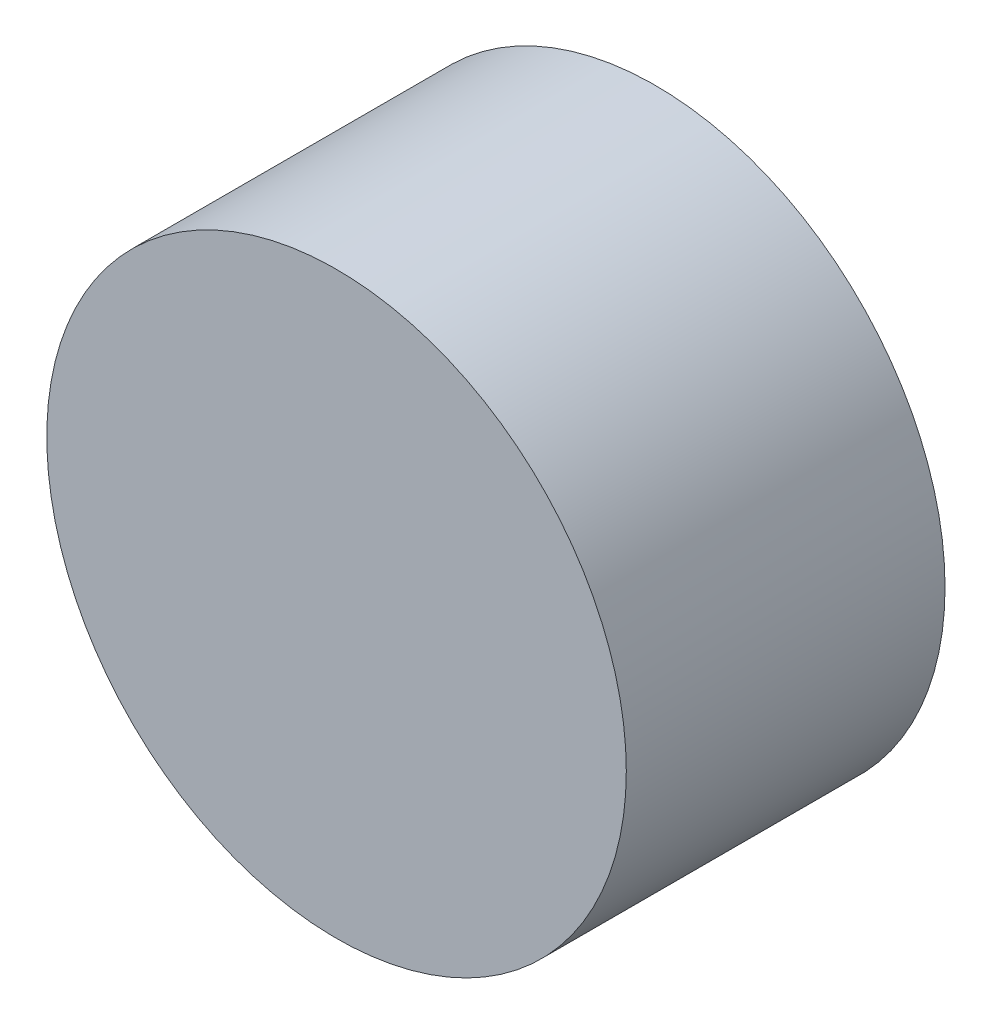
ISO-10303-21;
HEADER;
FILE_DESCRIPTION(('STEP AP214'),'2;1');
FILE_NAME('part.step','',(''),(''),'','','');
FILE_SCHEMA(('AUTOMOTIVE_DESIGN { 1 0 10303 214 1 1 1 1 }'));
ENDSEC;
DATA;
#1=APPLICATION_CONTEXT('core data for automotive mechanical design processes');
#2=APPLICATION_PROTOCOL_DEFINITION('international standard','automotive_design',2000,#1);
#3=PRODUCT_CONTEXT('',#1,'mechanical');
#4=PRODUCT('Part','Part','',(#3));
#5=PRODUCT_RELATED_PRODUCT_CATEGORY('part','',(#4));
#6=PRODUCT_DEFINITION_FORMATION('','',#4);
#7=PRODUCT_DEFINITION_CONTEXT('part definition',#1,'design');
#8=PRODUCT_DEFINITION('design','',#6,#7);
#9=PRODUCT_DEFINITION_SHAPE('','',#8);
#10=(LENGTH_UNIT() NAMED_UNIT(*) SI_UNIT(.MILLI.,.METRE.));
#11=(NAMED_UNIT(*) PLANE_ANGLE_UNIT() SI_UNIT($,.RADIAN.));
#12=(NAMED_UNIT(*) SI_UNIT($,.STERADIAN.) SOLID_ANGLE_UNIT());
#13=UNCERTAINTY_MEASURE_WITH_UNIT(LENGTH_MEASURE(1.E-05),#10,'distance_accuracy_value','');
#14=(GEOMETRIC_REPRESENTATION_CONTEXT(3) GLOBAL_UNCERTAINTY_ASSIGNED_CONTEXT((#13)) GLOBAL_UNIT_ASSIGNED_CONTEXT((#10,
#11,#12)) REPRESENTATION_CONTEXT('',''));
#15=CARTESIAN_POINT('',(0.,0.,0.));
#16=DIRECTION('',(0.,0.,1.));
#17=DIRECTION('',(1.,0.,0.));
#18=AXIS2_PLACEMENT_3D('',#15,#16,#17);
#19=CARTESIAN_POINT('',(0.,0.,5.5));
#20=DIRECTION('',(0.,0.,-1.));
#21=DIRECTION('',(-1.,0.,0.));
#22=AXIS2_PLACEMENT_3D('',#19,#20,#21);
#23=CYLINDRICAL_SURFACE('',#22,5.);
#24=CARTESIAN_POINT('',(0.,0.,5.5));
#25=DIRECTION('',(0.,0.,1.));
#26=DIRECTION('',(1.,0.,0.));
#27=AXIS2_PLACEMENT_3D('',#24,#25,#26);
#28=CIRCLE('',#27,5.);
#29=CARTESIAN_POINT('',(5.,0.,5.5));
#30=VERTEX_POINT('',#29);
#31=EDGE_CURVE('E10',#30,#30,#28,.T.);
#32=ORIENTED_EDGE('',*,*,#31,.F.);
#33=EDGE_LOOP('',(#32));
#34=FACE_BOUND('',#33,.T.);
#35=CARTESIAN_POINT('',(0.,0.,0.));
#36=DIRECTION('',(0.,0.,1.));
#37=DIRECTION('',(1.,0.,0.));
#38=AXIS2_PLACEMENT_3D('',#35,#36,#37);
#39=CIRCLE('',#38,5.);
#40=CARTESIAN_POINT('',(5.,0.,0.));
#41=VERTEX_POINT('',#40);
#42=EDGE_CURVE('E35',#41,#41,#39,.T.);
#43=ORIENTED_EDGE('',*,*,#42,.T.);
#44=EDGE_LOOP('',(#43));
#45=FACE_BOUND('',#44,.T.);
#46=ADVANCED_FACE('F32',(#34,#45),#23,.T.);
#47=CARTESIAN_POINT('',(0.,0.,5.5));
#48=DIRECTION('',(0.,0.,1.));
#49=DIRECTION('',(1.,0.,0.));
#50=AXIS2_PLACEMENT_3D('',#47,#48,#49);
#51=PLANE('',#50);
#52=ORIENTED_EDGE('',*,*,#31,.T.);
#53=EDGE_LOOP('',(#52));
#54=FACE_BOUND('',#53,.T.);
#55=ADVANCED_FACE('F47',(#54),#51,.T.);
#56=CARTESIAN_POINT('',(0.,0.,0.));
#57=DIRECTION('',(0.,0.,1.));
#58=DIRECTION('',(1.,0.,0.));
#59=AXIS2_PLACEMENT_3D('',#56,#57,#58);
#60=PLANE('',#59);
#61=ORIENTED_EDGE('',*,*,#42,.F.);
#62=EDGE_LOOP('',(#61));
#63=FACE_BOUND('',#62,.T.);
#64=ADVANCED_FACE('F45',(#63),#60,.F.);
#65=CLOSED_SHELL('',(#46,#55,#64));
#66=MANIFOLD_SOLID_BREP('B2',#65);
#67=ADVANCED_BREP_SHAPE_REPRESENTATION('',(#18,#66),#14);
#68=SHAPE_DEFINITION_REPRESENTATION(#9,#67);
ENDSEC;
END-ISO-10303-21;
